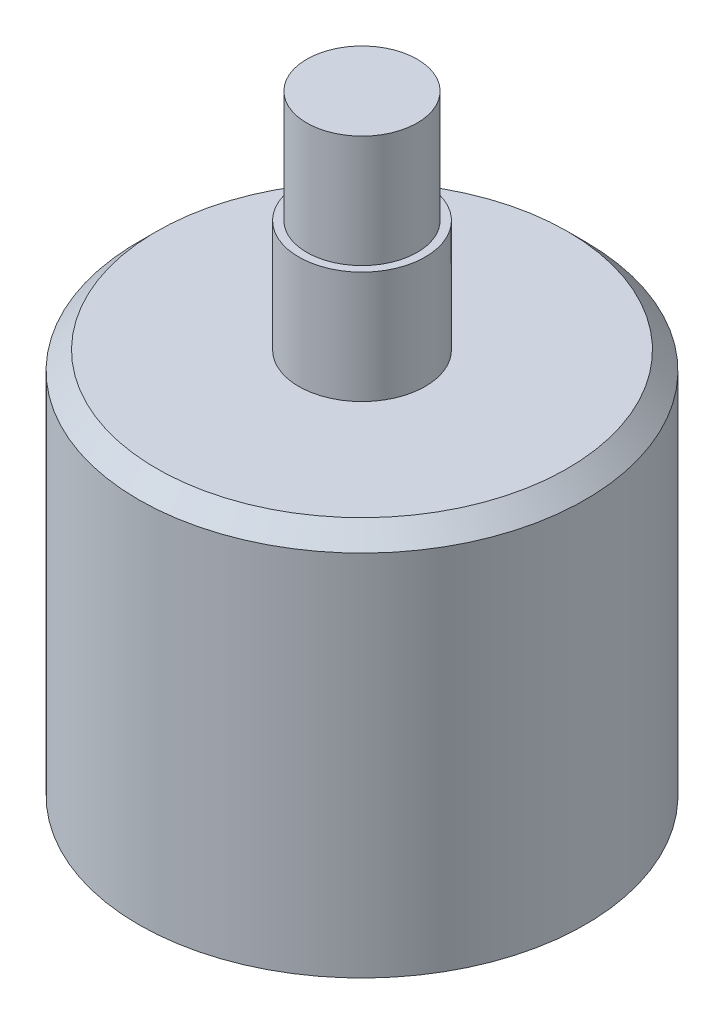
ISO-10303-21;
HEADER;
FILE_DESCRIPTION(('STEP AP214'),'2;1');
FILE_NAME('part.step','',(''),(''),'','','');
FILE_SCHEMA(('AUTOMOTIVE_DESIGN { 1 0 10303 214 1 1 1 1 }'));
ENDSEC;
DATA;
#1=APPLICATION_CONTEXT('core data for automotive mechanical design processes');
#2=APPLICATION_PROTOCOL_DEFINITION('international standard','automotive_design',2000,#1);
#3=PRODUCT_CONTEXT('',#1,'mechanical');
#4=PRODUCT('Part','Part','',(#3));
#5=PRODUCT_RELATED_PRODUCT_CATEGORY('part','',(#4));
#6=PRODUCT_DEFINITION_FORMATION('','',#4);
#7=PRODUCT_DEFINITION_CONTEXT('part definition',#1,'design');
#8=PRODUCT_DEFINITION('design','',#6,#7);
#9=PRODUCT_DEFINITION_SHAPE('','',#8);
#10=(LENGTH_UNIT() NAMED_UNIT(*) SI_UNIT(.MILLI.,.METRE.));
#11=(NAMED_UNIT(*) PLANE_ANGLE_UNIT() SI_UNIT($,.RADIAN.));
#12=(NAMED_UNIT(*) SI_UNIT($,.STERADIAN.) SOLID_ANGLE_UNIT());
#13=UNCERTAINTY_MEASURE_WITH_UNIT(LENGTH_MEASURE(1.E-05),#10,'distance_accuracy_value','');
#14=(GEOMETRIC_REPRESENTATION_CONTEXT(3) GLOBAL_UNCERTAINTY_ASSIGNED_CONTEXT((#13)) GLOBAL_UNIT_ASSIGNED_CONTEXT((#10,
#11,#12)) REPRESENTATION_CONTEXT('',''));
#15=CARTESIAN_POINT('',(0.,0.,0.));
#16=DIRECTION('',(0.,0.,1.));
#17=DIRECTION('',(1.,0.,0.));
#18=AXIS2_PLACEMENT_3D('',#15,#16,#17);
#19=CARTESIAN_POINT('',(0.,40.7,0.));
#20=DIRECTION('',(0.,1.,0.));
#21=DIRECTION('',(0.,0.,1.));
#22=AXIS2_PLACEMENT_3D('',#19,#20,#21);
#23=PLANE('',#22);
#24=CARTESIAN_POINT('',(0.,40.7,0.));
#25=DIRECTION('',(0.,-1.,0.));
#26=DIRECTION('',(0.,0.,-1.));
#27=AXIS2_PLACEMENT_3D('',#24,#25,#26);
#28=CIRCLE('',#27,3.45);
#29=CARTESIAN_POINT('',(0.,40.7,-3.45));
#30=VERTEX_POINT('',#29);
#31=EDGE_CURVE('E10',#30,#30,#28,.T.);
#32=ORIENTED_EDGE('',*,*,#31,.F.);
#33=EDGE_LOOP('',(#32));
#34=FACE_BOUND('',#33,.T.);
#35=ADVANCED_FACE('F32',(#34),#23,.T.);
#36=CARTESIAN_POINT('',(0.,0.,0.));
#37=DIRECTION('',(0.,-1.,0.));
#38=DIRECTION('',(0.,0.,-1.));
#39=AXIS2_PLACEMENT_3D('',#36,#37,#38);
#40=CYLINDRICAL_SURFACE('',#39,3.45);
#41=ORIENTED_EDGE('',*,*,#31,.T.);
#42=EDGE_LOOP('',(#41));
#43=FACE_BOUND('',#42,.T.);
#44=CARTESIAN_POINT('',(0.,33.7,0.));
#45=DIRECTION('',(0.,-1.,0.));
#46=DIRECTION('',(0.,0.,-1.));
#47=AXIS2_PLACEMENT_3D('',#44,#45,#46);
#48=CIRCLE('',#47,3.45);
#49=CARTESIAN_POINT('',(0.,33.7,-3.45));
#50=VERTEX_POINT('',#49);
#51=EDGE_CURVE('E38',#50,#50,#48,.T.);
#52=ORIENTED_EDGE('',*,*,#51,.F.);
#53=EDGE_LOOP('',(#52));
#54=FACE_BOUND('',#53,.T.);
#55=ADVANCED_FACE('F132',(#43,#54),#40,.T.);
#56=CARTESIAN_POINT('',(3.45,33.7,0.));
#57=DIRECTION('',(0.,1.,0.));
#58=DIRECTION('',(0.,0.,1.));
#59=AXIS2_PLACEMENT_3D('',#56,#57,#58);
#60=PLANE('',#59);
#61=ORIENTED_EDGE('',*,*,#51,.T.);
#62=EDGE_LOOP('',(#61));
#63=FACE_BOUND('',#62,.T.);
#64=CARTESIAN_POINT('',(0.,33.7,0.));
#65=DIRECTION('',(0.,-1.,0.));
#66=DIRECTION('',(0.,0.,-1.));
#67=AXIS2_PLACEMENT_3D('',#64,#65,#66);
#68=CIRCLE('',#67,3.95);
#69=CARTESIAN_POINT('',(0.,33.7,-3.95));
#70=VERTEX_POINT('',#69);
#71=EDGE_CURVE('E42',#70,#70,#68,.T.);
#72=ORIENTED_EDGE('',*,*,#71,.F.);
#73=EDGE_LOOP('',(#72));
#74=FACE_BOUND('',#73,.T.);
#75=ADVANCED_FACE('F137',(#63,#74),#60,.T.);
#76=CARTESIAN_POINT('',(0.,0.,0.));
#77=DIRECTION('',(0.,-1.,0.));
#78=DIRECTION('',(0.,0.,-1.));
#79=AXIS2_PLACEMENT_3D('',#76,#77,#78);
#80=CYLINDRICAL_SURFACE('',#79,3.95);
#81=ORIENTED_EDGE('',*,*,#71,.T.);
#82=EDGE_LOOP('',(#81));
#83=FACE_BOUND('',#82,.T.);
#84=CARTESIAN_POINT('',(0.,26.7,0.));
#85=DIRECTION('',(0.,-1.,0.));
#86=DIRECTION('',(0.,0.,-1.));
#87=AXIS2_PLACEMENT_3D('',#84,#85,#86);
#88=CIRCLE('',#87,3.95);
#89=CARTESIAN_POINT('',(0.,26.7,-3.95));
#90=VERTEX_POINT('',#89);
#91=EDGE_CURVE('E46',#90,#90,#88,.T.);
#92=ORIENTED_EDGE('',*,*,#91,.F.);
#93=EDGE_LOOP('',(#92));
#94=FACE_BOUND('',#93,.T.);
#95=ADVANCED_FACE('F141',(#83,#94),#80,.T.);
#96=CARTESIAN_POINT('',(3.95,26.7,0.));
#97=DIRECTION('',(0.,1.,0.));
#98=DIRECTION('',(0.,0.,1.));
#99=AXIS2_PLACEMENT_3D('',#96,#97,#98);
#100=PLANE('',#99);
#101=ORIENTED_EDGE('',*,*,#91,.T.);
#102=EDGE_LOOP('',(#101));
#103=FACE_BOUND('',#102,.T.);
#104=CARTESIAN_POINT('',(0.,26.7,0.));
#105=DIRECTION('',(0.,-1.,0.));
#106=DIRECTION('',(0.,0.,-1.));
#107=AXIS2_PLACEMENT_3D('',#104,#105,#106);
#108=CIRCLE('',#107,12.8274679848664);
#109=CARTESIAN_POINT('',(0.,26.7,-12.8274679848664));
#110=VERTEX_POINT('',#109);
#111=EDGE_CURVE('E51',#110,#110,#108,.T.);
#112=ORIENTED_EDGE('',*,*,#111,.F.);
#113=EDGE_LOOP('',(#112));
#114=FACE_BOUND('',#113,.T.);
#115=ADVANCED_FACE('F147',(#103,#114),#100,.T.);
#116=CARTESIAN_POINT('',(0.,25.5774679848664,0.));
#117=DIRECTION('',(0.,-1.,0.));
#118=DIRECTION('',(0.,0.,-1.));
#119=AXIS2_PLACEMENT_3D('',#116,#117,#118);
#120=CONICAL_SURFACE('',#119,13.95,0.785398163397448);
#121=ORIENTED_EDGE('',*,*,#111,.T.);
#122=EDGE_LOOP('',(#121));
#123=FACE_BOUND('',#122,.T.);
#124=CARTESIAN_POINT('',(0.,25.5774679848664,0.));
#125=DIRECTION('',(0.,-1.,0.));
#126=DIRECTION('',(0.,0.,-1.));
#127=AXIS2_PLACEMENT_3D('',#124,#125,#126);
#128=CIRCLE('',#127,13.95);
#129=CARTESIAN_POINT('',(0.,25.5774679848664,-13.95));
#130=VERTEX_POINT('',#129);
#131=EDGE_CURVE('E54',#130,#130,#128,.T.);
#132=ORIENTED_EDGE('',*,*,#131,.F.);
#133=EDGE_LOOP('',(#132));
#134=FACE_BOUND('',#133,.T.);
#135=ADVANCED_FACE('F151',(#123,#134),#120,.T.);
#136=CARTESIAN_POINT('',(0.,0.,0.));
#137=DIRECTION('',(0.,-1.,0.));
#138=DIRECTION('',(0.,0.,-1.));
#139=AXIS2_PLACEMENT_3D('',#136,#137,#138);
#140=CYLINDRICAL_SURFACE('',#139,13.95);
#141=ORIENTED_EDGE('',*,*,#131,.T.);
#142=EDGE_LOOP('',(#141));
#143=FACE_BOUND('',#142,.T.);
#144=CARTESIAN_POINT('',(0.,2.6,0.));
#145=DIRECTION('',(0.,-1.,0.));
#146=DIRECTION('',(0.,0.,-1.));
#147=AXIS2_PLACEMENT_3D('',#144,#145,#146);
#148=CIRCLE('',#147,13.95);
#149=CARTESIAN_POINT('',(0.,2.6,-13.95));
#150=VERTEX_POINT('',#149);
#151=EDGE_CURVE('E57',#150,#150,#148,.T.);
#152=ORIENTED_EDGE('',*,*,#151,.F.);
#153=EDGE_LOOP('',(#152));
#154=FACE_BOUND('',#153,.T.);
#155=ADVANCED_FACE('F104',(#143,#154),#140,.T.);
#156=CARTESIAN_POINT('',(13.95,2.6,0.));
#157=DIRECTION('',(0.,-1.,0.));
#158=DIRECTION('',(0.,0.,-1.));
#159=AXIS2_PLACEMENT_3D('',#156,#157,#158);
#160=PLANE('',#159);
#161=CARTESIAN_POINT('',(-9.5,2.6,0.));
#162=DIRECTION('',(0.,-1.,0.));
#163=DIRECTION('',(0.,0.,-1.));
#164=AXIS2_PLACEMENT_3D('',#161,#162,#163);
#165=CIRCLE('',#164,1.2573);
#166=CARTESIAN_POINT('',(-9.5,2.6,-1.2573));
#167=VERTEX_POINT('',#166);
#168=EDGE_CURVE('E85',#167,#167,#165,.T.);
#169=ORIENTED_EDGE('',*,*,#168,.F.);
#170=EDGE_LOOP('',(#169));
#171=FACE_BOUND('',#170,.T.);
#172=CARTESIAN_POINT('',(9.5,2.6,0.));
#173=DIRECTION('',(0.,-1.,0.));
#174=DIRECTION('',(0.,0.,-1.));
#175=AXIS2_PLACEMENT_3D('',#172,#173,#174);
#176=CIRCLE('',#175,1.2573);
#177=CARTESIAN_POINT('',(9.5,2.6,-1.2573));
#178=VERTEX_POINT('',#177);
#179=EDGE_CURVE('E79',#178,#178,#176,.T.);
#180=ORIENTED_EDGE('',*,*,#179,.F.);
#181=EDGE_LOOP('',(#180));
#182=FACE_BOUND('',#181,.T.);
#183=CARTESIAN_POINT('',(0.,2.6,8.));
#184=DIRECTION('',(0.,-1.,0.));
#185=DIRECTION('',(0.,0.,-1.));
#186=AXIS2_PLACEMENT_3D('',#183,#184,#185);
#187=CIRCLE('',#186,1.2573);
#188=CARTESIAN_POINT('',(0.,2.6,6.7427));
#189=VERTEX_POINT('',#188);
#190=EDGE_CURVE('E73',#189,#189,#187,.T.);
#191=ORIENTED_EDGE('',*,*,#190,.F.);
#192=EDGE_LOOP('',(#191));
#193=FACE_BOUND('',#192,.T.);
#194=CARTESIAN_POINT('',(0.,2.6,-8.));
#195=DIRECTION('',(0.,-1.,0.));
#196=DIRECTION('',(0.,0.,-1.));
#197=AXIS2_PLACEMENT_3D('',#194,#195,#196);
#198=CIRCLE('',#197,1.2573);
#199=CARTESIAN_POINT('',(0.,2.6,-9.2573));
#200=VERTEX_POINT('',#199);
#201=EDGE_CURVE('E67',#200,#200,#198,.T.);
#202=ORIENTED_EDGE('',*,*,#201,.F.);
#203=EDGE_LOOP('',(#202));
#204=FACE_BOUND('',#203,.T.);
#205=ORIENTED_EDGE('',*,*,#151,.T.);
#206=EDGE_LOOP('',(#205));
#207=FACE_BOUND('',#206,.T.);
#208=CARTESIAN_POINT('',(0.,2.6,0.));
#209=DIRECTION('',(0.,-1.,0.));
#210=DIRECTION('',(0.,0.,-1.));
#211=AXIS2_PLACEMENT_3D('',#208,#209,#210);
#212=CIRCLE('',#211,3.);
#213=CARTESIAN_POINT('',(0.,2.6,-3.));
#214=VERTEX_POINT('',#213);
#215=EDGE_CURVE('E60',#214,#214,#212,.T.);
#216=ORIENTED_EDGE('',*,*,#215,.F.);
#217=EDGE_LOOP('',(#216));
#218=FACE_BOUND('',#217,.T.);
#219=ADVANCED_FACE('F100',(#171,#182,#193,#204,#207,#218),#160,.T.);
#220=CARTESIAN_POINT('',(0.,0.,0.));
#221=DIRECTION('',(0.,-1.,0.));
#222=DIRECTION('',(0.,0.,-1.));
#223=AXIS2_PLACEMENT_3D('',#220,#221,#222);
#224=CYLINDRICAL_SURFACE('',#223,3.);
#225=ORIENTED_EDGE('',*,*,#215,.T.);
#226=EDGE_LOOP('',(#225));
#227=FACE_BOUND('',#226,.T.);
#228=CARTESIAN_POINT('',(0.,0.,0.));
#229=DIRECTION('',(0.,-1.,0.));
#230=DIRECTION('',(0.,0.,-1.));
#231=AXIS2_PLACEMENT_3D('',#228,#229,#230);
#232=CIRCLE('',#231,3.);
#233=CARTESIAN_POINT('',(0.,0.,-3.));
#234=VERTEX_POINT('',#233);
#235=EDGE_CURVE('E63',#234,#234,#232,.T.);
#236=ORIENTED_EDGE('',*,*,#235,.F.);
#237=EDGE_LOOP('',(#236));
#238=FACE_BOUND('',#237,.T.);
#239=ADVANCED_FACE('F103',(#227,#238),#224,.T.);
#240=CARTESIAN_POINT('',(3.,0.,0.));
#241=DIRECTION('',(0.,-1.,0.));
#242=DIRECTION('',(0.,0.,-1.));
#243=AXIS2_PLACEMENT_3D('',#240,#241,#242);
#244=PLANE('',#243);
#245=ORIENTED_EDGE('',*,*,#235,.T.);
#246=EDGE_LOOP('',(#245));
#247=FACE_BOUND('',#246,.T.);
#248=ADVANCED_FACE('F118',(#247),#244,.T.);
#249=CARTESIAN_POINT('',(0.,5.775,-8.));
#250=DIRECTION('',(0.,-1.,0.));
#251=DIRECTION('',(0.,0.,-1.));
#252=AXIS2_PLACEMENT_3D('',#249,#250,#251);
#253=CYLINDRICAL_SURFACE('',#252,1.2573);
#254=CARTESIAN_POINT('',(0.,5.775,-8.));
#255=DIRECTION('',(0.,-1.,0.));
#256=DIRECTION('',(0.,0.,-1.));
#257=AXIS2_PLACEMENT_3D('',#254,#255,#256);
#258=CIRCLE('',#257,1.2573);
#259=CARTESIAN_POINT('',(0.,5.775,-9.2573));
#260=VERTEX_POINT('',#259);
#261=EDGE_CURVE('E66',#260,#260,#258,.T.);
#262=ORIENTED_EDGE('',*,*,#261,.F.);
#263=EDGE_LOOP('',(#262));
#264=FACE_BOUND('',#263,.T.);
#265=ORIENTED_EDGE('',*,*,#201,.T.);
#266=EDGE_LOOP('',(#265));
#267=FACE_BOUND('',#266,.T.);
#268=ADVANCED_FACE('F123',(#264,#267),#253,.F.);
#269=CARTESIAN_POINT('',(0.,5.775,-8.));
#270=DIRECTION('',(0.,-1.,0.));
#271=DIRECTION('',(0.,0.,-1.));
#272=AXIS2_PLACEMENT_3D('',#269,#270,#271);
#273=PLANE('',#272);
#274=ORIENTED_EDGE('',*,*,#261,.T.);
#275=EDGE_LOOP('',(#274));
#276=FACE_BOUND('',#275,.T.);
#277=ADVANCED_FACE('F128',(#276),#273,.T.);
#278=CARTESIAN_POINT('',(0.,5.775,8.));
#279=DIRECTION('',(0.,-1.,0.));
#280=DIRECTION('',(0.,0.,-1.));
#281=AXIS2_PLACEMENT_3D('',#278,#279,#280);
#282=CYLINDRICAL_SURFACE('',#281,1.2573);
#283=CARTESIAN_POINT('',(0.,5.775,8.));
#284=DIRECTION('',(0.,-1.,0.));
#285=DIRECTION('',(0.,0.,-1.));
#286=AXIS2_PLACEMENT_3D('',#283,#284,#285);
#287=CIRCLE('',#286,1.2573);
#288=CARTESIAN_POINT('',(0.,5.775,6.7427));
#289=VERTEX_POINT('',#288);
#290=EDGE_CURVE('E76',#289,#289,#287,.T.);
#291=ORIENTED_EDGE('',*,*,#290,.F.);
#292=EDGE_LOOP('',(#291));
#293=FACE_BOUND('',#292,.T.);
#294=ORIENTED_EDGE('',*,*,#190,.T.);
#295=EDGE_LOOP('',(#294));
#296=FACE_BOUND('',#295,.T.);
#297=ADVANCED_FACE('F192',(#293,#296),#282,.F.);
#298=CARTESIAN_POINT('',(0.,5.775,8.));
#299=DIRECTION('',(0.,-1.,0.));
#300=DIRECTION('',(0.,0.,-1.));
#301=AXIS2_PLACEMENT_3D('',#298,#299,#300);
#302=PLANE('',#301);
#303=ORIENTED_EDGE('',*,*,#290,.T.);
#304=EDGE_LOOP('',(#303));
#305=FACE_BOUND('',#304,.T.);
#306=ADVANCED_FACE('F201',(#305),#302,.T.);
#307=CARTESIAN_POINT('',(9.5,5.775,0.));
#308=DIRECTION('',(0.,-1.,0.));
#309=DIRECTION('',(0.,0.,-1.));
#310=AXIS2_PLACEMENT_3D('',#307,#308,#309);
#311=CYLINDRICAL_SURFACE('',#310,1.2573);
#312=CARTESIAN_POINT('',(9.5,5.775,0.));
#313=DIRECTION('',(0.,-1.,0.));
#314=DIRECTION('',(0.,0.,-1.));
#315=AXIS2_PLACEMENT_3D('',#312,#313,#314);
#316=CIRCLE('',#315,1.2573);
#317=CARTESIAN_POINT('',(9.5,5.775,-1.2573));
#318=VERTEX_POINT('',#317);
#319=EDGE_CURVE('E82',#318,#318,#316,.T.);
#320=ORIENTED_EDGE('',*,*,#319,.F.);
#321=EDGE_LOOP('',(#320));
#322=FACE_BOUND('',#321,.T.);
#323=ORIENTED_EDGE('',*,*,#179,.T.);
#324=EDGE_LOOP('',(#323));
#325=FACE_BOUND('',#324,.T.);
#326=ADVANCED_FACE('F210',(#322,#325),#311,.F.);
#327=CARTESIAN_POINT('',(9.5,5.775,0.));
#328=DIRECTION('',(0.,-1.,0.));
#329=DIRECTION('',(0.,0.,-1.));
#330=AXIS2_PLACEMENT_3D('',#327,#328,#329);
#331=PLANE('',#330);
#332=ORIENTED_EDGE('',*,*,#319,.T.);
#333=EDGE_LOOP('',(#332));
#334=FACE_BOUND('',#333,.T.);
#335=ADVANCED_FACE('F96',(#334),#331,.T.);
#336=CARTESIAN_POINT('',(-9.5,5.775,0.));
#337=DIRECTION('',(0.,-1.,0.));
#338=DIRECTION('',(0.,0.,-1.));
#339=AXIS2_PLACEMENT_3D('',#336,#337,#338);
#340=CYLINDRICAL_SURFACE('',#339,1.2573);
#341=CARTESIAN_POINT('',(-9.5,5.775,0.));
#342=DIRECTION('',(0.,-1.,0.));
#343=DIRECTION('',(0.,0.,-1.));
#344=AXIS2_PLACEMENT_3D('',#341,#342,#343);
#345=CIRCLE('',#344,1.2573);
#346=CARTESIAN_POINT('',(-9.5,5.775,-1.2573));
#347=VERTEX_POINT('',#346);
#348=EDGE_CURVE('E70',#347,#347,#345,.T.);
#349=ORIENTED_EDGE('',*,*,#348,.F.);
#350=EDGE_LOOP('',(#349));
#351=FACE_BOUND('',#350,.T.);
#352=ORIENTED_EDGE('',*,*,#168,.T.);
#353=EDGE_LOOP('',(#352));
#354=FACE_BOUND('',#353,.T.);
#355=ADVANCED_FACE('F93',(#351,#354),#340,.F.);
#356=CARTESIAN_POINT('',(-9.5,5.775,0.));
#357=DIRECTION('',(0.,-1.,0.));
#358=DIRECTION('',(0.,0.,-1.));
#359=AXIS2_PLACEMENT_3D('',#356,#357,#358);
#360=PLANE('',#359);
#361=ORIENTED_EDGE('',*,*,#348,.T.);
#362=EDGE_LOOP('',(#361));
#363=FACE_BOUND('',#362,.T.);
#364=ADVANCED_FACE('F91',(#363),#360,.T.);
#365=CLOSED_SHELL('',(#35,#55,#75,#95,#115,#135,#155,#219,#239,#248,#268,#277,#297,#306,#326,
#335,#355,#364));
#366=MANIFOLD_SOLID_BREP('B2',#365);
#367=ADVANCED_BREP_SHAPE_REPRESENTATION('',(#18,#366),#14);
#368=SHAPE_DEFINITION_REPRESENTATION(#9,#367);
ENDSEC;
END-ISO-10303-21;
